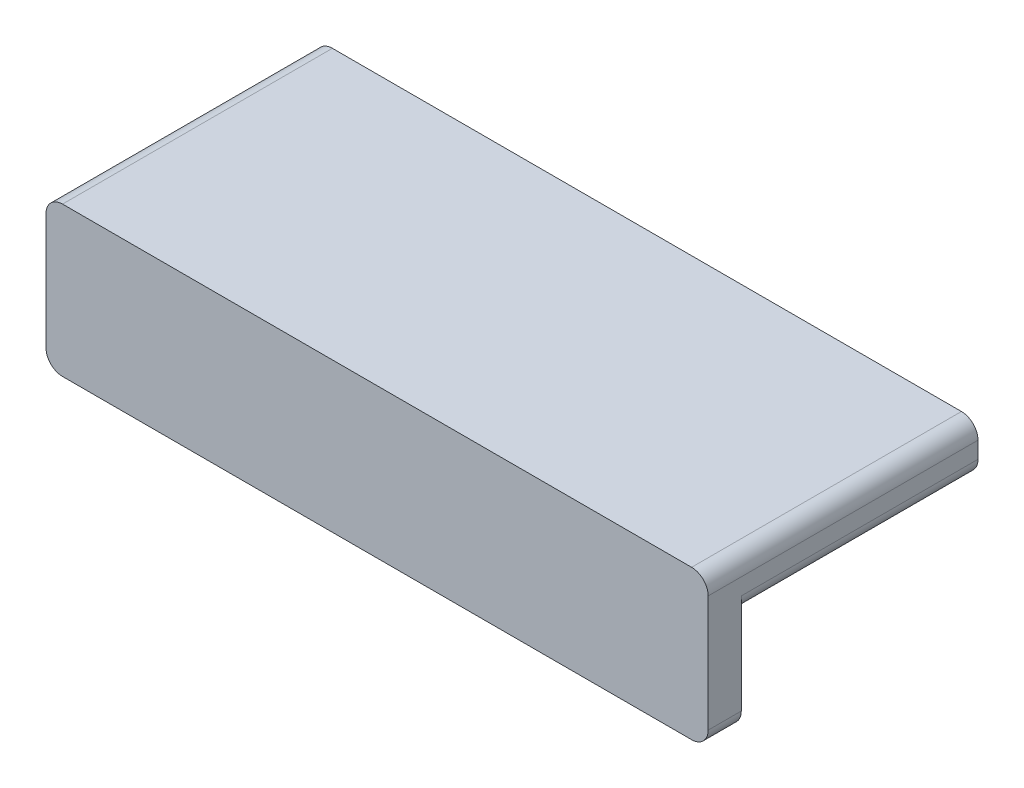
ISO-10303-21;
HEADER;
FILE_DESCRIPTION(('STEP AP214'),'2;1');
FILE_NAME('part.step','',(''),(''),'','','');
FILE_SCHEMA(('AUTOMOTIVE_DESIGN { 1 0 10303 214 1 1 1 1 }'));
ENDSEC;
DATA;
#1=APPLICATION_CONTEXT('core data for automotive mechanical design processes');
#2=APPLICATION_PROTOCOL_DEFINITION('international standard','automotive_design',2000,#1);
#3=PRODUCT_CONTEXT('',#1,'mechanical');
#4=PRODUCT('Part','Part','',(#3));
#5=PRODUCT_RELATED_PRODUCT_CATEGORY('part','',(#4));
#6=PRODUCT_DEFINITION_FORMATION('','',#4);
#7=PRODUCT_DEFINITION_CONTEXT('part definition',#1,'design');
#8=PRODUCT_DEFINITION('design','',#6,#7);
#9=PRODUCT_DEFINITION_SHAPE('','',#8);
#10=(LENGTH_UNIT() NAMED_UNIT(*) SI_UNIT(.MILLI.,.METRE.));
#11=(NAMED_UNIT(*) PLANE_ANGLE_UNIT() SI_UNIT($,.RADIAN.));
#12=(NAMED_UNIT(*) SI_UNIT($,.STERADIAN.) SOLID_ANGLE_UNIT());
#13=UNCERTAINTY_MEASURE_WITH_UNIT(LENGTH_MEASURE(1.E-05),#10,'distance_accuracy_value','');
#14=(GEOMETRIC_REPRESENTATION_CONTEXT(3) GLOBAL_UNCERTAINTY_ASSIGNED_CONTEXT((#13)) GLOBAL_UNIT_ASSIGNED_CONTEXT((#10,
#11,#12)) REPRESENTATION_CONTEXT('',''));
#15=CARTESIAN_POINT('',(0.,0.,0.));
#16=DIRECTION('',(0.,0.,1.));
#17=DIRECTION('',(1.,0.,0.));
#18=AXIS2_PLACEMENT_3D('',#15,#16,#17);
#19=CARTESIAN_POINT('',(-4.98,0.754999999999999,3.575));
#20=DIRECTION('',(1.,0.,0.));
#21=DIRECTION('',(0.,0.,-1.));
#22=AXIS2_PLACEMENT_3D('',#19,#20,#21);
#23=PLANE('',#22);
#24=DIRECTION('',(0.,-1.,0.));
#25=VECTOR('',#24,1.);
#26=CARTESIAN_POINT('',(-4.98,0.754999999999999,-3.575));
#27=LINE('',#26,#25);
#28=CARTESIAN_POINT('',(-4.98,0.754999999999999,-3.575));
#29=VERTEX_POINT('',#28);
#30=CARTESIAN_POINT('',(-4.98,-1.755,-3.575));
#31=VERTEX_POINT('',#30);
#32=EDGE_CURVE('E317',#29,#31,#27,.T.);
#33=ORIENTED_EDGE('',*,*,#32,.T.);
#34=DIRECTION('',(0.,0.,-1.));
#35=VECTOR('',#34,1.);
#36=CARTESIAN_POINT('',(-4.98,-1.755,3.575));
#37=LINE('',#36,#35);
#38=CARTESIAN_POINT('',(-4.98,-1.755,3.575));
#39=VERTEX_POINT('',#38);
#40=EDGE_CURVE('E188',#31,#39,#37,.F.);
#41=ORIENTED_EDGE('',*,*,#40,.T.);
#42=DIRECTION('',(0.,-1.,0.));
#43=VECTOR('',#42,1.);
#44=CARTESIAN_POINT('',(-4.98,0.754999999999999,3.575));
#45=LINE('',#44,#43);
#46=CARTESIAN_POINT('',(-4.98,0.754999999999999,3.575));
#47=VERTEX_POINT('',#46);
#48=EDGE_CURVE('E171',#47,#39,#45,.T.);
#49=ORIENTED_EDGE('',*,*,#48,.F.);
#50=DIRECTION('',(0.,0.,-1.));
#51=VECTOR('',#50,1.);
#52=CARTESIAN_POINT('',(-4.98,0.754999999999999,3.575));
#53=LINE('',#52,#51);
#54=EDGE_CURVE('E180',#47,#29,#53,.T.);
#55=ORIENTED_EDGE('',*,*,#54,.T.);
#56=EDGE_LOOP('',(#33,#41,#49,#55));
#57=FACE_BOUND('',#56,.T.);
#58=ADVANCED_FACE('F39',(#57),#23,.F.);
#59=CARTESIAN_POINT('',(-4.98,-2.255,3.575));
#60=DIRECTION('',(0.,1.,0.));
#61=DIRECTION('',(-1.,0.,0.));
#62=AXIS2_PLACEMENT_3D('',#59,#60,#61);
#63=PLANE('',#62);
#64=DIRECTION('',(1.,0.,0.));
#65=VECTOR('',#64,1.);
#66=CARTESIAN_POINT('',(-10.,-2.255,4.575));
#67=LINE('',#66,#65);
#68=CARTESIAN_POINT('',(-9.5,-2.255,4.575));
#69=VERTEX_POINT('',#68);
#70=CARTESIAN_POINT('',(9.5,-2.255,4.575));
#71=VERTEX_POINT('',#70);
#72=EDGE_CURVE('E323',#69,#71,#67,.T.);
#73=ORIENTED_EDGE('',*,*,#72,.F.);
#74=DIRECTION('',(0.,0.,-1.));
#75=VECTOR('',#74,1.);
#76=CARTESIAN_POINT('',(-9.5,-2.255,3.575));
#77=LINE('',#76,#75);
#78=CARTESIAN_POINT('',(-9.5,-2.255,3.575));
#79=VERTEX_POINT('',#78);
#80=EDGE_CURVE('E274',#69,#79,#77,.T.);
#81=ORIENTED_EDGE('',*,*,#80,.T.);
#82=DIRECTION('',(1.,0.,0.));
#83=VECTOR('',#82,1.);
#84=CARTESIAN_POINT('',(-10.,-2.255,3.575));
#85=LINE('',#84,#83);
#86=CARTESIAN_POINT('',(-4.48,-2.255,3.575));
#87=VERTEX_POINT('',#86);
#88=EDGE_CURVE('E301',#79,#87,#85,.T.);
#89=ORIENTED_EDGE('',*,*,#88,.T.);
#90=DIRECTION('',(0.,0.,-1.));
#91=VECTOR('',#90,1.);
#92=CARTESIAN_POINT('',(-4.48,-2.255,3.575));
#93=LINE('',#92,#91);
#94=CARTESIAN_POINT('',(-4.48,-2.255,-3.575));
#95=VERTEX_POINT('',#94);
#96=EDGE_CURVE('E270',#87,#95,#93,.T.);
#97=ORIENTED_EDGE('',*,*,#96,.T.);
#98=DIRECTION('',(1.,0.,0.));
#99=VECTOR('',#98,1.);
#100=CARTESIAN_POINT('',(-4.98,-2.255,-3.575));
#101=LINE('',#100,#99);
#102=CARTESIAN_POINT('',(4.48,-2.255,-3.575));
#103=VERTEX_POINT('',#102);
#104=EDGE_CURVE('E309',#95,#103,#101,.T.);
#105=ORIENTED_EDGE('',*,*,#104,.T.);
#106=DIRECTION('',(0.,0.,-1.));
#107=VECTOR('',#106,1.);
#108=CARTESIAN_POINT('',(4.48,-2.255,3.575));
#109=LINE('',#108,#107);
#110=CARTESIAN_POINT('',(4.48,-2.255,3.575));
#111=VERTEX_POINT('',#110);
#112=EDGE_CURVE('E266',#103,#111,#109,.F.);
#113=ORIENTED_EDGE('',*,*,#112,.T.);
#114=CARTESIAN_POINT('',(9.5,-2.255,3.575));
#115=VERTEX_POINT('',#114);
#116=EDGE_CURVE('E350',#111,#115,#85,.T.);
#117=ORIENTED_EDGE('',*,*,#116,.T.);
#118=DIRECTION('',(0.,0.,-1.));
#119=VECTOR('',#118,1.);
#120=CARTESIAN_POINT('',(9.5,-2.255,3.575));
#121=LINE('',#120,#119);
#122=EDGE_CURVE('E263',#115,#71,#121,.F.);
#123=ORIENTED_EDGE('',*,*,#122,.T.);
#124=EDGE_LOOP('',(#73,#81,#89,#97,#105,#113,#117,#123));
#125=FACE_BOUND('',#124,.T.);
#126=ADVANCED_FACE('F308',(#125),#63,.F.);
#127=CARTESIAN_POINT('',(4.98,-2.255,3.575));
#128=DIRECTION('',(-1.,0.,0.));
#129=DIRECTION('',(0.,0.,1.));
#130=AXIS2_PLACEMENT_3D('',#127,#128,#129);
#131=PLANE('',#130);
#132=DIRECTION('',(0.,1.,0.));
#133=VECTOR('',#132,1.);
#134=CARTESIAN_POINT('',(4.98,-2.255,3.575));
#135=LINE('',#134,#133);
#136=CARTESIAN_POINT('',(4.98,-1.755,3.575));
#137=VERTEX_POINT('',#136);
#138=CARTESIAN_POINT('',(4.98,0.755,3.575));
#139=VERTEX_POINT('',#138);
#140=EDGE_CURVE('E190',#137,#139,#135,.T.);
#141=ORIENTED_EDGE('',*,*,#140,.F.);
#142=DIRECTION('',(0.,0.,-1.));
#143=VECTOR('',#142,1.);
#144=CARTESIAN_POINT('',(4.98,-1.755,3.575));
#145=LINE('',#144,#143);
#146=CARTESIAN_POINT('',(4.98,-1.755,-3.575));
#147=VERTEX_POINT('',#146);
#148=EDGE_CURVE('E286',#137,#147,#145,.T.);
#149=ORIENTED_EDGE('',*,*,#148,.T.);
#150=DIRECTION('',(0.,1.,0.));
#151=VECTOR('',#150,1.);
#152=CARTESIAN_POINT('',(4.98,-2.255,-3.575));
#153=LINE('',#152,#151);
#154=CARTESIAN_POINT('',(4.98,0.755,-3.575));
#155=VERTEX_POINT('',#154);
#156=EDGE_CURVE('E316',#147,#155,#153,.T.);
#157=ORIENTED_EDGE('',*,*,#156,.T.);
#158=DIRECTION('',(0.,0.,-1.));
#159=VECTOR('',#158,1.);
#160=CARTESIAN_POINT('',(4.98,0.755,3.575));
#161=LINE('',#160,#159);
#162=EDGE_CURVE('E196',#139,#155,#161,.T.);
#163=ORIENTED_EDGE('',*,*,#162,.F.);
#164=EDGE_LOOP('',(#141,#149,#157,#163));
#165=FACE_BOUND('',#164,.T.);
#166=ADVANCED_FACE('F412',(#165),#131,.F.);
#167=CARTESIAN_POINT('',(4.98,0.755,3.575));
#168=DIRECTION('',(0.,1.,0.));
#169=DIRECTION('',(-1.,0.,0.));
#170=AXIS2_PLACEMENT_3D('',#167,#168,#169);
#171=PLANE('',#170);
#172=DIRECTION('',(1.,0.,0.));
#173=VECTOR('',#172,1.);
#174=CARTESIAN_POINT('',(4.98,0.755,-3.575));
#175=LINE('',#174,#173);
#176=CARTESIAN_POINT('',(9.5,0.755000000000003,-3.575));
#177=VERTEX_POINT('',#176);
#178=EDGE_CURVE('E321',#155,#177,#175,.T.);
#179=ORIENTED_EDGE('',*,*,#178,.T.);
#180=DIRECTION('',(0.,0.,-1.));
#181=VECTOR('',#180,1.);
#182=CARTESIAN_POINT('',(9.5,0.755000000000003,3.575));
#183=LINE('',#182,#181);
#184=CARTESIAN_POINT('',(9.5,0.755000000000003,3.575));
#185=VERTEX_POINT('',#184);
#186=EDGE_CURVE('E55',#177,#185,#183,.F.);
#187=ORIENTED_EDGE('',*,*,#186,.T.);
#188=DIRECTION('',(1.,0.,0.));
#189=VECTOR('',#188,1.);
#190=CARTESIAN_POINT('',(4.98,0.755,3.575));
#191=LINE('',#190,#189);
#192=EDGE_CURVE('E181',#139,#185,#191,.T.);
#193=ORIENTED_EDGE('',*,*,#192,.F.);
#194=ORIENTED_EDGE('',*,*,#162,.T.);
#195=EDGE_LOOP('',(#179,#187,#193,#194));
#196=FACE_BOUND('',#195,.T.);
#197=ADVANCED_FACE('F409',(#196),#171,.F.);
#198=CARTESIAN_POINT('',(10.,0.755000000000004,3.575));
#199=DIRECTION('',(-1.,0.,0.));
#200=DIRECTION('',(0.,0.,1.));
#201=AXIS2_PLACEMENT_3D('',#198,#199,#200);
#202=PLANE('',#201);
#203=DIRECTION('',(0.,1.,0.));
#204=VECTOR('',#203,1.);
#205=CARTESIAN_POINT('',(10.,0.755000000000004,-3.575));
#206=LINE('',#205,#204);
#207=CARTESIAN_POINT('',(10.,1.255,-3.575));
#208=VERTEX_POINT('',#207);
#209=CARTESIAN_POINT('',(10.,1.755,-3.575));
#210=VERTEX_POINT('',#209);
#211=EDGE_CURVE('E328',#208,#210,#206,.T.);
#212=ORIENTED_EDGE('',*,*,#211,.T.);
#213=DIRECTION('',(0.,0.,-1.));
#214=VECTOR('',#213,1.);
#215=CARTESIAN_POINT('',(10.,1.755,3.575));
#216=LINE('',#215,#214);
#217=CARTESIAN_POINT('',(10.,1.755,4.575));
#218=VERTEX_POINT('',#217);
#219=EDGE_CURVE('E260',#210,#218,#216,.F.);
#220=ORIENTED_EDGE('',*,*,#219,.T.);
#221=DIRECTION('',(0.,1.,0.));
#222=VECTOR('',#221,1.);
#223=CARTESIAN_POINT('',(10.,-2.255,4.575));
#224=LINE('',#223,#222);
#225=CARTESIAN_POINT('',(10.,-1.755,4.575));
#226=VERTEX_POINT('',#225);
#227=EDGE_CURVE('E349',#226,#218,#224,.T.);
#228=ORIENTED_EDGE('',*,*,#227,.F.);
#229=DIRECTION('',(0.,0.,-1.));
#230=VECTOR('',#229,1.);
#231=CARTESIAN_POINT('',(10.,-1.755,3.575));
#232=LINE('',#231,#230);
#233=CARTESIAN_POINT('',(10.,-1.755,3.575));
#234=VERTEX_POINT('',#233);
#235=EDGE_CURVE('E256',#226,#234,#232,.T.);
#236=ORIENTED_EDGE('',*,*,#235,.T.);
#237=DIRECTION('',(0.,1.,0.));
#238=VECTOR('',#237,1.);
#239=CARTESIAN_POINT('',(10.,-2.255,3.575));
#240=LINE('',#239,#238);
#241=CARTESIAN_POINT('',(10.,1.255,3.575));
#242=VERTEX_POINT('',#241);
#243=EDGE_CURVE('E355',#234,#242,#240,.T.);
#244=ORIENTED_EDGE('',*,*,#243,.T.);
#245=DIRECTION('',(0.,0.,-1.));
#246=VECTOR('',#245,1.);
#247=CARTESIAN_POINT('',(10.,1.255,3.575));
#248=LINE('',#247,#246);
#249=EDGE_CURVE('E252',#242,#208,#248,.T.);
#250=ORIENTED_EDGE('',*,*,#249,.T.);
#251=EDGE_LOOP('',(#212,#220,#228,#236,#244,#250));
#252=FACE_BOUND('',#251,.T.);
#253=ADVANCED_FACE('F404',(#252),#202,.F.);
#254=CARTESIAN_POINT('',(10.,2.255,3.575));
#255=DIRECTION('',(0.,-1.,0.));
#256=DIRECTION('',(1.,0.,0.));
#257=AXIS2_PLACEMENT_3D('',#254,#255,#256);
#258=PLANE('',#257);
#259=DIRECTION('',(-1.,0.,0.));
#260=VECTOR('',#259,1.);
#261=CARTESIAN_POINT('',(10.,2.255,-3.575));
#262=LINE('',#261,#260);
#263=CARTESIAN_POINT('',(9.5,2.255,-3.575));
#264=VERTEX_POINT('',#263);
#265=CARTESIAN_POINT('',(-9.5,2.255,-3.575));
#266=VERTEX_POINT('',#265);
#267=EDGE_CURVE('E332',#264,#266,#262,.T.);
#268=ORIENTED_EDGE('',*,*,#267,.T.);
#269=DIRECTION('',(0.,0.,-1.));
#270=VECTOR('',#269,1.);
#271=CARTESIAN_POINT('',(-9.5,2.255,3.575));
#272=LINE('',#271,#270);
#273=CARTESIAN_POINT('',(-9.5,2.255,4.575));
#274=VERTEX_POINT('',#273);
#275=EDGE_CURVE('E237',#266,#274,#272,.F.);
#276=ORIENTED_EDGE('',*,*,#275,.T.);
#277=DIRECTION('',(-1.,0.,0.));
#278=VECTOR('',#277,1.);
#279=CARTESIAN_POINT('',(-10.,2.255,4.575));
#280=LINE('',#279,#278);
#281=CARTESIAN_POINT('',(9.5,2.255,4.575));
#282=VERTEX_POINT('',#281);
#283=EDGE_CURVE('E365',#282,#274,#280,.T.);
#284=ORIENTED_EDGE('',*,*,#283,.F.);
#285=DIRECTION('',(0.,0.,-1.));
#286=VECTOR('',#285,1.);
#287=CARTESIAN_POINT('',(9.5,2.255,3.575));
#288=LINE('',#287,#286);
#289=EDGE_CURVE('E233',#282,#264,#288,.T.);
#290=ORIENTED_EDGE('',*,*,#289,.T.);
#291=EDGE_LOOP('',(#268,#276,#284,#290));
#292=FACE_BOUND('',#291,.T.);
#293=ADVANCED_FACE('F385',(#292),#258,.F.);
#294=CARTESIAN_POINT('',(-10.,2.255,3.575));
#295=DIRECTION('',(1.,0.,0.));
#296=DIRECTION('',(0.,0.,-1.));
#297=AXIS2_PLACEMENT_3D('',#294,#295,#296);
#298=PLANE('',#297);
#299=DIRECTION('',(0.,-1.,0.));
#300=VECTOR('',#299,1.);
#301=CARTESIAN_POINT('',(-10.,-2.255,4.575));
#302=LINE('',#301,#300);
#303=CARTESIAN_POINT('',(-10.,1.755,4.575));
#304=VERTEX_POINT('',#303);
#305=CARTESIAN_POINT('',(-10.,-1.755,4.575));
#306=VERTEX_POINT('',#305);
#307=EDGE_CURVE('E361',#304,#306,#302,.T.);
#308=ORIENTED_EDGE('',*,*,#307,.F.);
#309=DIRECTION('',(0.,0.,-1.));
#310=VECTOR('',#309,1.);
#311=CARTESIAN_POINT('',(-10.,1.755,3.575));
#312=LINE('',#311,#310);
#313=CARTESIAN_POINT('',(-10.,1.755,-3.575));
#314=VERTEX_POINT('',#313);
#315=EDGE_CURVE('E211',#304,#314,#312,.T.);
#316=ORIENTED_EDGE('',*,*,#315,.T.);
#317=DIRECTION('',(0.,-1.,0.));
#318=VECTOR('',#317,1.);
#319=CARTESIAN_POINT('',(-10.,2.255,-3.575));
#320=LINE('',#319,#318);
#321=CARTESIAN_POINT('',(-10.,1.255,-3.575));
#322=VERTEX_POINT('',#321);
#323=EDGE_CURVE('E335',#314,#322,#320,.T.);
#324=ORIENTED_EDGE('',*,*,#323,.T.);
#325=DIRECTION('',(0.,0.,-1.));
#326=VECTOR('',#325,1.);
#327=CARTESIAN_POINT('',(-10.,1.255,3.575));
#328=LINE('',#327,#326);
#329=CARTESIAN_POINT('',(-10.,1.255,3.575));
#330=VERTEX_POINT('',#329);
#331=EDGE_CURVE('E200',#322,#330,#328,.F.);
#332=ORIENTED_EDGE('',*,*,#331,.T.);
#333=DIRECTION('',(0.,-1.,0.));
#334=VECTOR('',#333,1.);
#335=CARTESIAN_POINT('',(-10.,-2.255,3.575));
#336=LINE('',#335,#334);
#337=CARTESIAN_POINT('',(-10.,-1.755,3.575));
#338=VERTEX_POINT('',#337);
#339=EDGE_CURVE('E351',#330,#338,#336,.T.);
#340=ORIENTED_EDGE('',*,*,#339,.T.);
#341=DIRECTION('',(0.,0.,-1.));
#342=VECTOR('',#341,1.);
#343=CARTESIAN_POINT('',(-10.,-1.755,3.575));
#344=LINE('',#343,#342);
#345=EDGE_CURVE('E208',#338,#306,#344,.F.);
#346=ORIENTED_EDGE('',*,*,#345,.T.);
#347=EDGE_LOOP('',(#308,#316,#324,#332,#340,#346));
#348=FACE_BOUND('',#347,.T.);
#349=ADVANCED_FACE('F393',(#348),#298,.F.);
#350=CARTESIAN_POINT('',(-10.,0.754999999999999,3.575));
#351=DIRECTION('',(0.,1.,0.));
#352=DIRECTION('',(0.,0.,1.));
#353=AXIS2_PLACEMENT_3D('',#350,#351,#352);
#354=PLANE('',#353);
#355=DIRECTION('',(1.,0.,0.));
#356=VECTOR('',#355,1.);
#357=CARTESIAN_POINT('',(-10.,0.754999999999999,3.575));
#358=LINE('',#357,#356);
#359=CARTESIAN_POINT('',(-9.5,0.754999999999999,3.575));
#360=VERTEX_POINT('',#359);
#361=EDGE_CURVE('E166',#360,#47,#358,.T.);
#362=ORIENTED_EDGE('',*,*,#361,.F.);
#363=DIRECTION('',(0.,0.,-1.));
#364=VECTOR('',#363,1.);
#365=CARTESIAN_POINT('',(-9.5,0.754999999999999,3.575));
#366=LINE('',#365,#364);
#367=CARTESIAN_POINT('',(-9.5,0.754999999999999,-3.575));
#368=VERTEX_POINT('',#367);
#369=EDGE_CURVE('E283',#360,#368,#366,.T.);
#370=ORIENTED_EDGE('',*,*,#369,.T.);
#371=DIRECTION('',(1.,0.,0.));
#372=VECTOR('',#371,1.);
#373=CARTESIAN_POINT('',(-10.,0.754999999999999,-3.575));
#374=LINE('',#373,#372);
#375=EDGE_CURVE('E191',#368,#29,#374,.T.);
#376=ORIENTED_EDGE('',*,*,#375,.T.);
#377=ORIENTED_EDGE('',*,*,#54,.F.);
#378=EDGE_LOOP('',(#362,#370,#376,#377));
#379=FACE_BOUND('',#378,.T.);
#380=ADVANCED_FACE('F193',(#379),#354,.F.);
#381=CARTESIAN_POINT('',(0.,0.,-3.575));
#382=DIRECTION('',(0.,0.,1.));
#383=DIRECTION('',(1.,0.,0.));
#384=AXIS2_PLACEMENT_3D('',#381,#382,#383);
#385=PLANE('',#384);
#386=ORIENTED_EDGE('',*,*,#323,.F.);
#387=CARTESIAN_POINT('',(-9.5,1.755,-3.575));
#388=DIRECTION('',(0.,0.,1.));
#389=DIRECTION('',(1.,0.,0.));
#390=AXIS2_PLACEMENT_3D('',#387,#388,#389);
#391=CIRCLE('',#390,0.5);
#392=EDGE_CURVE('E230',#314,#266,#391,.F.);
#393=ORIENTED_EDGE('',*,*,#392,.T.);
#394=ORIENTED_EDGE('',*,*,#267,.F.);
#395=CARTESIAN_POINT('',(9.5,1.755,-3.575));
#396=DIRECTION('',(0.,0.,1.));
#397=DIRECTION('',(1.,0.,0.));
#398=AXIS2_PLACEMENT_3D('',#395,#396,#397);
#399=CIRCLE('',#398,0.5);
#400=EDGE_CURVE('E227',#264,#210,#399,.F.);
#401=ORIENTED_EDGE('',*,*,#400,.T.);
#402=ORIENTED_EDGE('',*,*,#211,.F.);
#403=CARTESIAN_POINT('',(9.5,1.255,-3.575));
#404=DIRECTION('',(0.,0.,1.));
#405=DIRECTION('',(1.,0.,0.));
#406=AXIS2_PLACEMENT_3D('',#403,#404,#405);
#407=CIRCLE('',#406,0.5);
#408=EDGE_CURVE('E215',#208,#177,#407,.F.);
#409=ORIENTED_EDGE('',*,*,#408,.T.);
#410=ORIENTED_EDGE('',*,*,#178,.F.);
#411=ORIENTED_EDGE('',*,*,#156,.F.);
#412=CARTESIAN_POINT('',(4.48,-1.755,-3.575));
#413=DIRECTION('',(0.,0.,1.));
#414=DIRECTION('',(1.,0.,0.));
#415=AXIS2_PLACEMENT_3D('',#412,#413,#414);
#416=CIRCLE('',#415,0.5);
#417=EDGE_CURVE('E218',#147,#103,#416,.F.);
#418=ORIENTED_EDGE('',*,*,#417,.T.);
#419=ORIENTED_EDGE('',*,*,#104,.F.);
#420=CARTESIAN_POINT('',(-4.48,-1.755,-3.575));
#421=DIRECTION('',(0.,0.,1.));
#422=DIRECTION('',(1.,0.,0.));
#423=AXIS2_PLACEMENT_3D('',#420,#421,#422);
#424=CIRCLE('',#423,0.5);
#425=EDGE_CURVE('E224',#95,#31,#424,.F.);
#426=ORIENTED_EDGE('',*,*,#425,.T.);
#427=ORIENTED_EDGE('',*,*,#32,.F.);
#428=ORIENTED_EDGE('',*,*,#375,.F.);
#429=CARTESIAN_POINT('',(-9.5,1.255,-3.575));
#430=DIRECTION('',(0.,0.,1.));
#431=DIRECTION('',(1.,0.,0.));
#432=AXIS2_PLACEMENT_3D('',#429,#430,#431);
#433=CIRCLE('',#432,0.5);
#434=EDGE_CURVE('E221',#368,#322,#433,.F.);
#435=ORIENTED_EDGE('',*,*,#434,.T.);
#436=EDGE_LOOP('',(#386,#393,#394,#401,#402,#409,#410,#411,#418,#419,#426,#427,#428,#435));
#437=FACE_BOUND('',#436,.T.);
#438=ADVANCED_FACE('F313',(#437),#385,.F.);
#439=CARTESIAN_POINT('',(0.,0.,3.575));
#440=DIRECTION('',(0.,0.,-1.));
#441=DIRECTION('',(-1.,0.,0.));
#442=AXIS2_PLACEMENT_3D('',#439,#440,#441);
#443=PLANE('',#442);
#444=ORIENTED_EDGE('',*,*,#243,.F.);
#445=CARTESIAN_POINT('',(9.5,-1.755,3.575));
#446=DIRECTION('',(0.,0.,-1.));
#447=DIRECTION('',(-1.,0.,0.));
#448=AXIS2_PLACEMENT_3D('',#445,#446,#447);
#449=CIRCLE('',#448,0.5);
#450=EDGE_CURVE('E290',#234,#115,#449,.T.);
#451=ORIENTED_EDGE('',*,*,#450,.T.);
#452=ORIENTED_EDGE('',*,*,#116,.F.);
#453=CARTESIAN_POINT('',(4.48,-1.755,3.575));
#454=DIRECTION('',(0.,0.,-1.));
#455=DIRECTION('',(-1.,0.,0.));
#456=AXIS2_PLACEMENT_3D('',#453,#454,#455);
#457=CIRCLE('',#456,0.5);
#458=EDGE_CURVE('E48',#111,#137,#457,.F.);
#459=ORIENTED_EDGE('',*,*,#458,.T.);
#460=ORIENTED_EDGE('',*,*,#140,.T.);
#461=ORIENTED_EDGE('',*,*,#192,.T.);
#462=CARTESIAN_POINT('',(9.5,1.255,3.575));
#463=DIRECTION('',(0.,0.,-1.));
#464=DIRECTION('',(-1.,0.,0.));
#465=AXIS2_PLACEMENT_3D('',#462,#463,#464);
#466=CIRCLE('',#465,0.5);
#467=EDGE_CURVE('E11',#185,#242,#466,.F.);
#468=ORIENTED_EDGE('',*,*,#467,.T.);
#469=EDGE_LOOP('',(#444,#451,#452,#459,#460,#461,#468));
#470=FACE_BOUND('',#469,.T.);
#471=ADVANCED_FACE('F405',(#470),#443,.T.);
#472=CARTESIAN_POINT('',(0.,0.,4.575));
#473=DIRECTION('',(0.,0.,-1.));
#474=DIRECTION('',(-1.,0.,0.));
#475=AXIS2_PLACEMENT_3D('',#472,#473,#474);
#476=PLANE('',#475);
#477=ORIENTED_EDGE('',*,*,#283,.T.);
#478=CARTESIAN_POINT('',(-9.5,1.755,4.575));
#479=DIRECTION('',(0.,0.,-1.));
#480=DIRECTION('',(-1.,0.,0.));
#481=AXIS2_PLACEMENT_3D('',#478,#479,#480);
#482=CIRCLE('',#481,0.5);
#483=EDGE_CURVE('E249',#274,#304,#482,.F.);
#484=ORIENTED_EDGE('',*,*,#483,.T.);
#485=ORIENTED_EDGE('',*,*,#307,.T.);
#486=CARTESIAN_POINT('',(-9.5,-1.755,4.575));
#487=DIRECTION('',(0.,0.,-1.));
#488=DIRECTION('',(-1.,0.,0.));
#489=AXIS2_PLACEMENT_3D('',#486,#487,#488);
#490=CIRCLE('',#489,0.5);
#491=EDGE_CURVE('E243',#306,#69,#490,.F.);
#492=ORIENTED_EDGE('',*,*,#491,.T.);
#493=ORIENTED_EDGE('',*,*,#72,.T.);
#494=CARTESIAN_POINT('',(9.5,-1.755,4.575));
#495=DIRECTION('',(0.,0.,-1.));
#496=DIRECTION('',(-1.,0.,0.));
#497=AXIS2_PLACEMENT_3D('',#494,#495,#496);
#498=CIRCLE('',#497,0.5);
#499=EDGE_CURVE('E240',#71,#226,#498,.F.);
#500=ORIENTED_EDGE('',*,*,#499,.T.);
#501=ORIENTED_EDGE('',*,*,#227,.T.);
#502=CARTESIAN_POINT('',(9.5,1.755,4.575));
#503=DIRECTION('',(0.,0.,-1.));
#504=DIRECTION('',(-1.,0.,0.));
#505=AXIS2_PLACEMENT_3D('',#502,#503,#504);
#506=CIRCLE('',#505,0.5);
#507=EDGE_CURVE('E246',#218,#282,#506,.F.);
#508=ORIENTED_EDGE('',*,*,#507,.T.);
#509=EDGE_LOOP('',(#477,#484,#485,#492,#493,#500,#501,#508));
#510=FACE_BOUND('',#509,.T.);
#511=ADVANCED_FACE('F374',(#510),#476,.F.);
#512=ORIENTED_EDGE('',*,*,#88,.F.);
#513=CARTESIAN_POINT('',(-9.5,-1.755,3.575));
#514=DIRECTION('',(0.,0.,-1.));
#515=DIRECTION('',(-1.,0.,0.));
#516=AXIS2_PLACEMENT_3D('',#513,#514,#515);
#517=CIRCLE('',#516,0.5);
#518=EDGE_CURVE('E278',#79,#338,#517,.T.);
#519=ORIENTED_EDGE('',*,*,#518,.T.);
#520=ORIENTED_EDGE('',*,*,#339,.F.);
#521=CARTESIAN_POINT('',(-9.5,1.255,3.575));
#522=DIRECTION('',(0.,0.,-1.));
#523=DIRECTION('',(-1.,0.,0.));
#524=AXIS2_PLACEMENT_3D('',#521,#522,#523);
#525=CIRCLE('',#524,0.5);
#526=EDGE_CURVE('E174',#330,#360,#525,.F.);
#527=ORIENTED_EDGE('',*,*,#526,.T.);
#528=ORIENTED_EDGE('',*,*,#361,.T.);
#529=ORIENTED_EDGE('',*,*,#48,.T.);
#530=CARTESIAN_POINT('',(-4.48,-1.755,3.575));
#531=DIRECTION('',(0.,0.,-1.));
#532=DIRECTION('',(-1.,0.,0.));
#533=AXIS2_PLACEMENT_3D('',#530,#531,#532);
#534=CIRCLE('',#533,0.5);
#535=EDGE_CURVE('E295',#39,#87,#534,.F.);
#536=ORIENTED_EDGE('',*,*,#535,.T.);
#537=EDGE_LOOP('',(#512,#519,#520,#527,#528,#529,#536));
#538=FACE_BOUND('',#537,.T.);
#539=ADVANCED_FACE('F169',(#538),#443,.T.);
#540=CARTESIAN_POINT('',(-9.5,1.755,3.575));
#541=DIRECTION('',(0.,0.,-1.));
#542=DIRECTION('',(-1.,0.,0.));
#543=AXIS2_PLACEMENT_3D('',#540,#541,#542);
#544=CYLINDRICAL_SURFACE('',#543,0.5);
#545=ORIENTED_EDGE('',*,*,#483,.F.);
#546=ORIENTED_EDGE('',*,*,#275,.F.);
#547=ORIENTED_EDGE('',*,*,#392,.F.);
#548=ORIENTED_EDGE('',*,*,#315,.F.);
#549=EDGE_LOOP('',(#545,#546,#547,#548));
#550=FACE_BOUND('',#549,.T.);
#551=ADVANCED_FACE('F391',(#550),#544,.T.);
#552=CARTESIAN_POINT('',(9.5,1.755,3.575));
#553=DIRECTION('',(0.,0.,-1.));
#554=DIRECTION('',(-1.,0.,0.));
#555=AXIS2_PLACEMENT_3D('',#552,#553,#554);
#556=CYLINDRICAL_SURFACE('',#555,0.5);
#557=ORIENTED_EDGE('',*,*,#507,.F.);
#558=ORIENTED_EDGE('',*,*,#219,.F.);
#559=ORIENTED_EDGE('',*,*,#400,.F.);
#560=ORIENTED_EDGE('',*,*,#289,.F.);
#561=EDGE_LOOP('',(#557,#558,#559,#560));
#562=FACE_BOUND('',#561,.T.);
#563=ADVANCED_FACE('F382',(#562),#556,.T.);
#564=CARTESIAN_POINT('',(-9.5,-1.755,3.575));
#565=DIRECTION('',(0.,0.,-1.));
#566=DIRECTION('',(-1.,0.,0.));
#567=AXIS2_PLACEMENT_3D('',#564,#565,#566);
#568=CYLINDRICAL_SURFACE('',#567,0.5);
#569=ORIENTED_EDGE('',*,*,#491,.F.);
#570=ORIENTED_EDGE('',*,*,#345,.F.);
#571=ORIENTED_EDGE('',*,*,#518,.F.);
#572=ORIENTED_EDGE('',*,*,#80,.F.);
#573=EDGE_LOOP('',(#569,#570,#571,#572));
#574=FACE_BOUND('',#573,.T.);
#575=ADVANCED_FACE('F398',(#574),#568,.T.);
#576=CARTESIAN_POINT('',(-4.48,-1.755,3.575));
#577=DIRECTION('',(0.,0.,-1.));
#578=DIRECTION('',(-1.,0.,0.));
#579=AXIS2_PLACEMENT_3D('',#576,#577,#578);
#580=CYLINDRICAL_SURFACE('',#579,0.5);
#581=ORIENTED_EDGE('',*,*,#535,.F.);
#582=ORIENTED_EDGE('',*,*,#40,.F.);
#583=ORIENTED_EDGE('',*,*,#425,.F.);
#584=ORIENTED_EDGE('',*,*,#96,.F.);
#585=EDGE_LOOP('',(#581,#582,#583,#584));
#586=FACE_BOUND('',#585,.T.);
#587=ADVANCED_FACE('F303',(#586),#580,.T.);
#588=CARTESIAN_POINT('',(-9.5,1.255,3.575));
#589=DIRECTION('',(0.,0.,-1.));
#590=DIRECTION('',(-1.,0.,0.));
#591=AXIS2_PLACEMENT_3D('',#588,#589,#590);
#592=CYLINDRICAL_SURFACE('',#591,0.5);
#593=ORIENTED_EDGE('',*,*,#526,.F.);
#594=ORIENTED_EDGE('',*,*,#331,.F.);
#595=ORIENTED_EDGE('',*,*,#434,.F.);
#596=ORIENTED_EDGE('',*,*,#369,.F.);
#597=EDGE_LOOP('',(#593,#594,#595,#596));
#598=FACE_BOUND('',#597,.T.);
#599=ADVANCED_FACE('F418',(#598),#592,.T.);
#600=CARTESIAN_POINT('',(4.48,-1.755,3.575));
#601=DIRECTION('',(0.,0.,-1.));
#602=DIRECTION('',(-1.,0.,0.));
#603=AXIS2_PLACEMENT_3D('',#600,#601,#602);
#604=CYLINDRICAL_SURFACE('',#603,0.5);
#605=ORIENTED_EDGE('',*,*,#458,.F.);
#606=ORIENTED_EDGE('',*,*,#112,.F.);
#607=ORIENTED_EDGE('',*,*,#417,.F.);
#608=ORIENTED_EDGE('',*,*,#148,.F.);
#609=EDGE_LOOP('',(#605,#606,#607,#608));
#610=FACE_BOUND('',#609,.T.);
#611=ADVANCED_FACE('F415',(#610),#604,.T.);
#612=CARTESIAN_POINT('',(9.5,-1.755,3.575));
#613=DIRECTION('',(0.,0.,-1.));
#614=DIRECTION('',(-1.,0.,0.));
#615=AXIS2_PLACEMENT_3D('',#612,#613,#614);
#616=CYLINDRICAL_SURFACE('',#615,0.5);
#617=ORIENTED_EDGE('',*,*,#499,.F.);
#618=ORIENTED_EDGE('',*,*,#122,.F.);
#619=ORIENTED_EDGE('',*,*,#450,.F.);
#620=ORIENTED_EDGE('',*,*,#235,.F.);
#621=EDGE_LOOP('',(#617,#618,#619,#620));
#622=FACE_BOUND('',#621,.T.);
#623=ADVANCED_FACE('F402',(#622),#616,.T.);
#624=CARTESIAN_POINT('',(9.5,1.255,3.575));
#625=DIRECTION('',(0.,0.,-1.));
#626=DIRECTION('',(-1.,0.,0.));
#627=AXIS2_PLACEMENT_3D('',#624,#625,#626);
#628=CYLINDRICAL_SURFACE('',#627,0.5);
#629=ORIENTED_EDGE('',*,*,#467,.F.);
#630=ORIENTED_EDGE('',*,*,#186,.F.);
#631=ORIENTED_EDGE('',*,*,#408,.F.);
#632=ORIENTED_EDGE('',*,*,#249,.F.);
#633=EDGE_LOOP('',(#629,#630,#631,#632));
#634=FACE_BOUND('',#633,.T.);
#635=ADVANCED_FACE('F41',(#634),#628,.T.);
#636=CLOSED_SHELL('',(#58,#126,#166,#197,#253,#293,#349,#380,#438,#471,#511,#539,#551,#563,#575,
#587,#599,#611,#623,#635));
#637=MANIFOLD_SOLID_BREP('B2',#636);
#638=ADVANCED_BREP_SHAPE_REPRESENTATION('',(#18,#637),#14);
#639=SHAPE_DEFINITION_REPRESENTATION(#9,#638);
ENDSEC;
END-ISO-10303-21;
